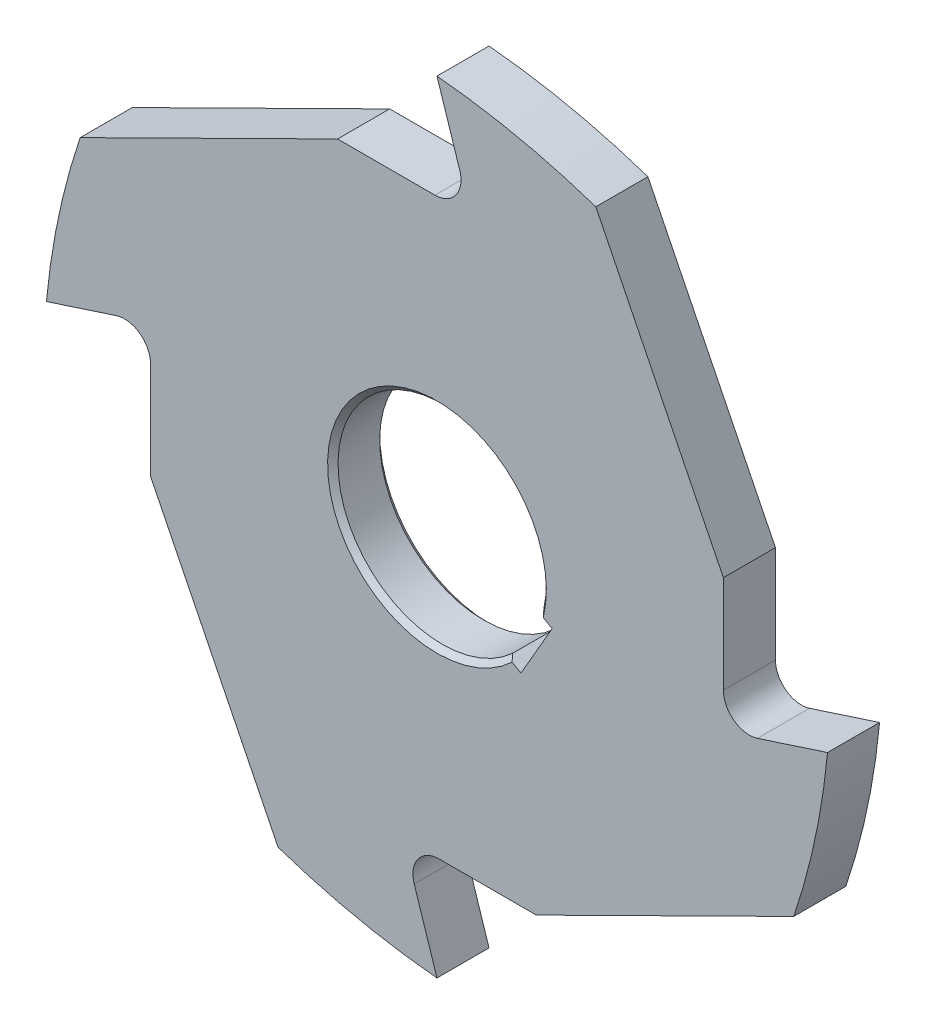
ISO-10303-21;
HEADER;
FILE_DESCRIPTION(('STEP AP214'),'2;1');
FILE_NAME('part.step','',(''),(''),'','','');
FILE_SCHEMA(('AUTOMOTIVE_DESIGN { 1 0 10303 214 1 1 1 1 }'));
ENDSEC;
DATA;
#1=APPLICATION_CONTEXT('core data for automotive mechanical design processes');
#2=APPLICATION_PROTOCOL_DEFINITION('international standard','automotive_design',2000,#1);
#3=PRODUCT_CONTEXT('',#1,'mechanical');
#4=PRODUCT('Part','Part','',(#3));
#5=PRODUCT_RELATED_PRODUCT_CATEGORY('part','',(#4));
#6=PRODUCT_DEFINITION_FORMATION('','',#4);
#7=PRODUCT_DEFINITION_CONTEXT('part definition',#1,'design');
#8=PRODUCT_DEFINITION('design','',#6,#7);
#9=PRODUCT_DEFINITION_SHAPE('','',#8);
#10=(LENGTH_UNIT() NAMED_UNIT(*) SI_UNIT(.MILLI.,.METRE.));
#11=(NAMED_UNIT(*) PLANE_ANGLE_UNIT() SI_UNIT($,.RADIAN.));
#12=(NAMED_UNIT(*) SI_UNIT($,.STERADIAN.) SOLID_ANGLE_UNIT());
#13=UNCERTAINTY_MEASURE_WITH_UNIT(LENGTH_MEASURE(1.E-05),#10,'distance_accuracy_value','');
#14=(GEOMETRIC_REPRESENTATION_CONTEXT(3) GLOBAL_UNCERTAINTY_ASSIGNED_CONTEXT((#13)) GLOBAL_UNIT_ASSIGNED_CONTEXT((#10,
#11,#12)) REPRESENTATION_CONTEXT('',''));
#15=CARTESIAN_POINT('',(0.,0.,0.));
#16=DIRECTION('',(0.,0.,1.));
#17=DIRECTION('',(1.,0.,0.));
#18=AXIS2_PLACEMENT_3D('',#15,#16,#17);
#19=CARTESIAN_POINT('',(0.,0.,-10.));
#20=DIRECTION('',(0.,0.,1.));
#21=DIRECTION('',(1.,0.,0.));
#22=AXIS2_PLACEMENT_3D('',#19,#20,#21);
#23=CYLINDRICAL_SURFACE('',#22,20.);
#24=DIRECTION('',(0.,0.,1.));
#25=VECTOR('',#24,1.);
#26=CARTESIAN_POINT('',(13.5227116418582,-14.7355444368762,-10.));
#27=LINE('',#26,#25);
#28=CARTESIAN_POINT('',(13.5227116418582,-14.7355444368762,-8.99999999999999));
#29=VERTEX_POINT('',#28);
#30=CARTESIAN_POINT('',(13.5227116418582,-14.7355444368762,-0.999999999999973));
#31=VERTEX_POINT('',#30);
#32=EDGE_CURVE('E351',#29,#31,#27,.T.);
#33=ORIENTED_EDGE('',*,*,#32,.F.);
#34=CARTESIAN_POINT('',(0.,0.,-8.99999999999999));
#35=DIRECTION('',(0.,0.,1.));
#36=DIRECTION('',(1.,0.,0.));
#37=AXIS2_PLACEMENT_3D('',#34,#35,#36);
#38=CIRCLE('',#37,20.);
#39=CARTESIAN_POINT('',(19.5227116418583,-4.34323959146292,-8.99999999999999));
#40=VERTEX_POINT('',#39);
#41=EDGE_CURVE('E529',#29,#40,#38,.F.);
#42=ORIENTED_EDGE('',*,*,#41,.T.);
#43=DIRECTION('',(0.,0.,1.));
#44=VECTOR('',#43,1.);
#45=CARTESIAN_POINT('',(19.5227116418583,-4.34323959146292,-10.));
#46=LINE('',#45,#44);
#47=CARTESIAN_POINT('',(19.5227116418583,-4.34323959146292,-0.999999999999973));
#48=VERTEX_POINT('',#47);
#49=EDGE_CURVE('E361',#40,#48,#46,.T.);
#50=ORIENTED_EDGE('',*,*,#49,.T.);
#51=CARTESIAN_POINT('',(0.,0.,-0.999999999999973));
#52=DIRECTION('',(0.,0.,1.));
#53=DIRECTION('',(1.,0.,0.));
#54=AXIS2_PLACEMENT_3D('',#51,#52,#53);
#55=CIRCLE('',#54,20.);
#56=EDGE_CURVE('E531',#48,#31,#55,.T.);
#57=ORIENTED_EDGE('',*,*,#56,.T.);
#58=EDGE_LOOP('',(#33,#42,#50,#57));
#59=FACE_BOUND('',#58,.T.);
#60=ADVANCED_FACE('F35',(#59),#23,.F.);
#61=CARTESIAN_POINT('',(-3.00000000000003,-5.19615242270663,-10.));
#62=DIRECTION('',(-0.500000000000003,-0.866025403784437,0.));
#63=DIRECTION('',(0.866025403784437,-0.500000000000003,0.));
#64=AXIS2_PLACEMENT_3D('',#61,#62,#63);
#65=PLANE('',#64);
#66=DIRECTION('',(0.866025403784437,-0.500000000000003,0.));
#67=VECTOR('',#66,1.);
#68=CARTESIAN_POINT('',(-3.00000000000003,-5.19615242270663,-10.));
#69=LINE('',#68,#67);
#70=CARTESIAN_POINT('',(14.4284250579333,-15.2584583214558,-10.));
#71=VERTEX_POINT('',#70);
#72=CARTESIAN_POINT('',(16.1207878532115,-16.2355444368762,-10.));
#73=VERTEX_POINT('',#72);
#74=EDGE_CURVE('E220',#71,#73,#69,.T.);
#75=ORIENTED_EDGE('',*,*,#74,.F.);
#76=CARTESIAN_POINT('',(14.4284250579333,-15.2584583214558,-10.));
#77=CARTESIAN_POINT('',(14.2776376878442,-15.1714011927444,-9.83313424107122));
#78=CARTESIAN_POINT('',(14.1267678853945,-15.0842964716875,-9.66636802893565));
#79=CARTESIAN_POINT('',(13.8248634133721,-14.9099918434958,-9.33303469559915));
#80=CARTESIAN_POINT('',(13.6738287437968,-14.8227919363595,-9.16646757440138));
#81=CARTESIAN_POINT('',(13.5227116418582,-14.7355444368762,-8.99999999999999));
#82=B_SPLINE_CURVE_WITH_KNOTS('',3,(#76,#77,#78,#79,#80,#81),.UNSPECIFIED.,.F.,.F.,(4,2,4),(0.,
0.723490907396184,1.44698182630376),.UNSPECIFIED.);
#83=EDGE_CURVE('E407',#71,#29,#82,.T.);
#84=ORIENTED_EDGE('',*,*,#83,.T.);
#85=ORIENTED_EDGE('',*,*,#32,.T.);
#86=CARTESIAN_POINT('',(13.5227116418582,-14.7355444368762,-0.999999999999973));
#87=CARTESIAN_POINT('',(13.6738287437968,-14.8227919363595,-0.833532425598594));
#88=CARTESIAN_POINT('',(13.8248634133721,-14.9099918434958,-0.666965304400827));
#89=CARTESIAN_POINT('',(14.1267678853945,-15.0842964716875,-0.333631971064335));
#90=CARTESIAN_POINT('',(14.2776376878442,-15.1714011927444,-0.166865758928778));
#91=CARTESIAN_POINT('',(14.4284250579333,-15.2584583214557,0.));
#92=B_SPLINE_CURVE_WITH_KNOTS('',3,(#86,#87,#88,#89,#90,#91),.UNSPECIFIED.,.F.,.F.,(4,2,4),(0.,
0.723490918907552,1.44698182630371),.UNSPECIFIED.);
#93=CARTESIAN_POINT('',(14.4284250579333,-15.2584583214557,0.));
#94=VERTEX_POINT('',#93);
#95=EDGE_CURVE('E401',#31,#94,#92,.T.);
#96=ORIENTED_EDGE('',*,*,#95,.T.);
#97=DIRECTION('',(0.866025403784437,-0.500000000000003,0.));
#98=VECTOR('',#97,1.);
#99=CARTESIAN_POINT('',(-3.00000000000003,-5.19615242270663,0.));
#100=LINE('',#99,#98);
#101=CARTESIAN_POINT('',(16.1207878532115,-16.2355444368762,0.));
#102=VERTEX_POINT('',#101);
#103=EDGE_CURVE('E229',#94,#102,#100,.T.);
#104=ORIENTED_EDGE('',*,*,#103,.T.);
#105=DIRECTION('',(0.,0.,1.));
#106=VECTOR('',#105,1.);
#107=CARTESIAN_POINT('',(16.1207878532115,-16.2355444368762,-10.));
#108=LINE('',#107,#106);
#109=EDGE_CURVE('E355',#73,#102,#108,.T.);
#110=ORIENTED_EDGE('',*,*,#109,.F.);
#111=EDGE_LOOP('',(#75,#84,#85,#96,#104,#110));
#112=FACE_BOUND('',#111,.T.);
#113=ADVANCED_FACE('F412',(#112),#65,.F.);
#114=CARTESIAN_POINT('',(19.1207878532116,-11.0393920141695,-10.));
#115=DIRECTION('',(-0.866025403784436,0.500000000000004,0.));
#116=DIRECTION('',(-0.500000000000004,-0.866025403784436,0.));
#117=AXIS2_PLACEMENT_3D('',#114,#115,#116);
#118=PLANE('',#117);
#119=DIRECTION('',(-0.500000000000004,-0.866025403784436,0.));
#120=VECTOR('',#119,1.);
#121=CARTESIAN_POINT('',(19.1207878532116,-11.0393920141695,0.));
#122=LINE('',#121,#120);
#123=CARTESIAN_POINT('',(22.1207878532116,-5.84323959146293,0.));
#124=VERTEX_POINT('',#123);
#125=EDGE_CURVE('E347',#124,#102,#122,.T.);
#126=ORIENTED_EDGE('',*,*,#125,.F.);
#127=DIRECTION('',(0.,0.,1.));
#128=VECTOR('',#127,1.);
#129=CARTESIAN_POINT('',(22.1207878532116,-5.84323959146293,-10.));
#130=LINE('',#129,#128);
#131=CARTESIAN_POINT('',(22.1207878532116,-5.84323959146293,-10.));
#132=VERTEX_POINT('',#131);
#133=EDGE_CURVE('E358',#132,#124,#130,.T.);
#134=ORIENTED_EDGE('',*,*,#133,.F.);
#135=DIRECTION('',(-0.500000000000004,-0.866025403784436,0.));
#136=VECTOR('',#135,1.);
#137=CARTESIAN_POINT('',(19.1207878532116,-11.0393920141695,-10.));
#138=LINE('',#137,#136);
#139=EDGE_CURVE('E284',#132,#73,#138,.T.);
#140=ORIENTED_EDGE('',*,*,#139,.T.);
#141=ORIENTED_EDGE('',*,*,#109,.T.);
#142=EDGE_LOOP('',(#126,#134,#140,#141));
#143=FACE_BOUND('',#142,.T.);
#144=ADVANCED_FACE('F417',(#143),#118,.T.);
#145=CARTESIAN_POINT('',(-60.,-0.3835156776972,-10.));
#146=DIRECTION('',(0.,0.,1.));
#147=DIRECTION('',(1.,0.,0.));
#148=AXIS2_PLACEMENT_3D('',#145,#146,#147);
#149=CYLINDRICAL_SURFACE('',#148,4.99999999999999);
#150=CARTESIAN_POINT('',(-60.,-0.3835156776972,0.));
#151=DIRECTION('',(0.,0.,1.));
#152=DIRECTION('',(1.,0.,0.));
#153=AXIS2_PLACEMENT_3D('',#150,#151,#152);
#154=CIRCLE('',#153,4.99999999999999);
#155=CARTESIAN_POINT('',(-55.,-0.383515677697252,0.));
#156=VERTEX_POINT('',#155);
#157=CARTESIAN_POINT('',(-61.5450849718746,4.3717669037786,0.));
#158=VERTEX_POINT('',#157);
#159=EDGE_CURVE('E288',#156,#158,#154,.T.);
#160=ORIENTED_EDGE('',*,*,#159,.T.);
#161=DIRECTION('',(0.,0.,1.));
#162=VECTOR('',#161,1.);
#163=CARTESIAN_POINT('',(-61.5450849718746,4.3717669037786,-10.));
#164=LINE('',#163,#162);
#165=CARTESIAN_POINT('',(-61.5450849718746,4.3717669037786,-10.));
#166=VERTEX_POINT('',#165);
#167=EDGE_CURVE('E225',#166,#158,#164,.T.);
#168=ORIENTED_EDGE('',*,*,#167,.F.);
#169=CARTESIAN_POINT('',(-60.,-0.3835156776972,-10.));
#170=DIRECTION('',(0.,0.,1.));
#171=DIRECTION('',(1.,0.,0.));
#172=AXIS2_PLACEMENT_3D('',#169,#170,#171);
#173=CIRCLE('',#172,4.99999999999999);
#174=CARTESIAN_POINT('',(-55.,-0.383515677697252,-10.));
#175=VERTEX_POINT('',#174);
#176=EDGE_CURVE('E223',#175,#166,#173,.T.);
#177=ORIENTED_EDGE('',*,*,#176,.F.);
#178=DIRECTION('',(0.,0.,1.));
#179=VECTOR('',#178,1.);
#180=CARTESIAN_POINT('',(-55.,-0.383515677697252,-10.));
#181=LINE('',#180,#179);
#182=EDGE_CURVE('E209',#175,#156,#181,.T.);
#183=ORIENTED_EDGE('',*,*,#182,.T.);
#184=EDGE_LOOP('',(#160,#168,#177,#183));
#185=FACE_BOUND('',#184,.T.);
#186=ADVANCED_FACE('F224',(#185),#149,.F.);
#187=CARTESIAN_POINT('',(-7.16186271093895,22.0419469609674,-10.));
#188=DIRECTION('',(0.309016994374931,-0.951056516295159,0.));
#189=DIRECTION('',(0.951056516295159,0.309016994374931,0.));
#190=AXIS2_PLACEMENT_3D('',#187,#188,#189);
#191=PLANE('',#190);
#192=DIRECTION('',(0.951056516295159,0.309016994374931,0.));
#193=VECTOR('',#192,1.);
#194=CARTESIAN_POINT('',(-7.16186271093895,22.0419469609674,0.));
#195=LINE('',#194,#193);
#196=CARTESIAN_POINT('',(-75.,7.8756445809347E-13,0.));
#197=VERTEX_POINT('',#196);
#198=EDGE_CURVE('E342',#197,#158,#195,.T.);
#199=ORIENTED_EDGE('',*,*,#198,.F.);
#200=DIRECTION('',(0.,0.,1.));
#201=VECTOR('',#200,1.);
#202=CARTESIAN_POINT('',(-75.,7.8756445809347E-13,-10.));
#203=LINE('',#202,#201);
#204=CARTESIAN_POINT('',(-75.,7.8756445809347E-13,-10.));
#205=VERTEX_POINT('',#204);
#206=EDGE_CURVE('E364',#205,#197,#203,.T.);
#207=ORIENTED_EDGE('',*,*,#206,.F.);
#208=DIRECTION('',(0.951056516295159,0.309016994374931,0.));
#209=VECTOR('',#208,1.);
#210=CARTESIAN_POINT('',(-7.16186271093895,22.0419469609674,-10.));
#211=LINE('',#210,#209);
#212=EDGE_CURVE('E280',#205,#166,#211,.T.);
#213=ORIENTED_EDGE('',*,*,#212,.T.);
#214=ORIENTED_EDGE('',*,*,#167,.T.);
#215=EDGE_LOOP('',(#199,#207,#213,#214));
#216=FACE_BOUND('',#215,.T.);
#217=ADVANCED_FACE('F447',(#216),#191,.T.);
#218=CARTESIAN_POINT('',(59.4081249488118,-12.6275867743834,-10.));
#219=DIRECTION('',(0.,0.,1.));
#220=DIRECTION('',(1.,0.,0.));
#221=AXIS2_PLACEMENT_3D('',#218,#219,#220);
#222=CYLINDRICAL_SURFACE('',#221,135.);
#223=CARTESIAN_POINT('',(59.4081249488118,-12.6275867743834,0.));
#224=DIRECTION('',(0.,0.,1.));
#225=DIRECTION('',(1.,0.,0.));
#226=AXIS2_PLACEMENT_3D('',#223,#224,#225);
#227=CIRCLE('',#226,135.);
#228=CARTESIAN_POINT('',(-68.5159093231945,30.5052482306864,0.));
#229=VERTEX_POINT('',#228);
#230=EDGE_CURVE('E339',#197,#229,#227,.F.);
#231=ORIENTED_EDGE('',*,*,#230,.T.);
#232=DIRECTION('',(0.,0.,1.));
#233=VECTOR('',#232,1.);
#234=CARTESIAN_POINT('',(-68.5159093231945,30.5052482306864,-10.));
#235=LINE('',#234,#233);
#236=CARTESIAN_POINT('',(-68.5159093231945,30.5052482306864,-10.));
#237=VERTEX_POINT('',#236);
#238=EDGE_CURVE('E366',#237,#229,#235,.T.);
#239=ORIENTED_EDGE('',*,*,#238,.F.);
#240=CARTESIAN_POINT('',(59.4081249488118,-12.6275867743834,-10.));
#241=DIRECTION('',(0.,0.,1.));
#242=DIRECTION('',(1.,0.,0.));
#243=AXIS2_PLACEMENT_3D('',#240,#241,#242);
#244=CIRCLE('',#243,135.);
#245=EDGE_CURVE('E278',#205,#237,#244,.F.);
#246=ORIENTED_EDGE('',*,*,#245,.F.);
#247=ORIENTED_EDGE('',*,*,#206,.T.);
#248=EDGE_LOOP('',(#231,#239,#246,#247));
#249=FACE_BOUND('',#248,.T.);
#250=ADVANCED_FACE('F513',(#249),#222,.T.);
#251=CARTESIAN_POINT('',(-25.6402170443291,51.7489882953533,-10.));
#252=DIRECTION('',(-0.443965408465407,0.896043925310665,0.));
#253=DIRECTION('',(-0.896043925310665,-0.443965408465407,0.));
#254=AXIS2_PLACEMENT_3D('',#251,#252,#253);
#255=PLANE('',#254);
#256=DIRECTION('',(-0.896043925310665,-0.443965408465407,0.));
#257=VECTOR('',#256,1.);
#258=CARTESIAN_POINT('',(-25.6402170443291,51.7489882953533,0.));
#259=LINE('',#258,#257);
#260=CARTESIAN_POINT('',(-19.0787840283387,55.,0.));
#261=VERTEX_POINT('',#260);
#262=EDGE_CURVE('E336',#261,#229,#259,.T.);
#263=ORIENTED_EDGE('',*,*,#262,.F.);
#264=DIRECTION('',(0.,0.,1.));
#265=VECTOR('',#264,1.);
#266=CARTESIAN_POINT('',(-19.0787840283387,55.,-10.));
#267=LINE('',#266,#265);
#268=CARTESIAN_POINT('',(-19.0787840283387,55.,-10.));
#269=VERTEX_POINT('',#268);
#270=EDGE_CURVE('E368',#269,#261,#267,.T.);
#271=ORIENTED_EDGE('',*,*,#270,.F.);
#272=DIRECTION('',(-0.896043925310665,-0.443965408465407,0.));
#273=VECTOR('',#272,1.);
#274=CARTESIAN_POINT('',(-25.6402170443291,51.7489882953533,-10.));
#275=LINE('',#274,#273);
#276=EDGE_CURVE('E275',#269,#237,#275,.T.);
#277=ORIENTED_EDGE('',*,*,#276,.T.);
#278=ORIENTED_EDGE('',*,*,#238,.T.);
#279=EDGE_LOOP('',(#263,#271,#277,#278));
#280=FACE_BOUND('',#279,.T.);
#281=ADVANCED_FACE('F509',(#280),#255,.T.);
#282=CARTESIAN_POINT('',(0.,55.,-10.));
#283=DIRECTION('',(0.,1.,0.));
#284=DIRECTION('',(-1.,0.,0.));
#285=AXIS2_PLACEMENT_3D('',#282,#283,#284);
#286=PLANE('',#285);
#287=DIRECTION('',(-1.,0.,0.));
#288=VECTOR('',#287,1.);
#289=CARTESIAN_POINT('',(0.,55.,0.));
#290=LINE('',#289,#288);
#291=CARTESIAN_POINT('',(-0.383515677697828,55.,0.));
#292=VERTEX_POINT('',#291);
#293=EDGE_CURVE('E333',#292,#261,#290,.T.);
#294=ORIENTED_EDGE('',*,*,#293,.F.);
#295=DIRECTION('',(0.,0.,1.));
#296=VECTOR('',#295,1.);
#297=CARTESIAN_POINT('',(-0.383515677697828,55.,-10.));
#298=LINE('',#297,#296);
#299=CARTESIAN_POINT('',(-0.383515677697828,55.,-10.));
#300=VERTEX_POINT('',#299);
#301=EDGE_CURVE('E370',#300,#292,#298,.T.);
#302=ORIENTED_EDGE('',*,*,#301,.F.);
#303=DIRECTION('',(-1.,0.,0.));
#304=VECTOR('',#303,1.);
#305=CARTESIAN_POINT('',(0.,55.,-10.));
#306=LINE('',#305,#304);
#307=EDGE_CURVE('E272',#300,#269,#306,.T.);
#308=ORIENTED_EDGE('',*,*,#307,.T.);
#309=ORIENTED_EDGE('',*,*,#270,.T.);
#310=EDGE_LOOP('',(#294,#302,#308,#309));
#311=FACE_BOUND('',#310,.T.);
#312=ADVANCED_FACE('F505',(#311),#286,.T.);
#313=CARTESIAN_POINT('',(-0.383515677697828,60.,-10.));
#314=DIRECTION('',(0.,0.,1.));
#315=DIRECTION('',(1.,0.,0.));
#316=AXIS2_PLACEMENT_3D('',#313,#314,#315);
#317=CYLINDRICAL_SURFACE('',#316,4.99999999999999);
#318=CARTESIAN_POINT('',(-0.383515677697828,60.,0.));
#319=DIRECTION('',(0.,0.,1.));
#320=DIRECTION('',(1.,0.,0.));
#321=AXIS2_PLACEMENT_3D('',#318,#319,#320);
#322=CIRCLE('',#321,4.99999999999999);
#323=CARTESIAN_POINT('',(4.37176690377795,61.5450849718747,0.));
#324=VERTEX_POINT('',#323);
#325=EDGE_CURVE('E330',#292,#324,#322,.T.);
#326=ORIENTED_EDGE('',*,*,#325,.T.);
#327=DIRECTION('',(0.,0.,1.));
#328=VECTOR('',#327,1.);
#329=CARTESIAN_POINT('',(4.37176690377795,61.5450849718747,-10.));
#330=LINE('',#329,#328);
#331=CARTESIAN_POINT('',(4.37176690377795,61.5450849718747,-10.));
#332=VERTEX_POINT('',#331);
#333=EDGE_CURVE('E372',#332,#324,#330,.T.);
#334=ORIENTED_EDGE('',*,*,#333,.F.);
#335=CARTESIAN_POINT('',(-0.383515677697828,60.,-10.));
#336=DIRECTION('',(0.,0.,1.));
#337=DIRECTION('',(1.,0.,0.));
#338=AXIS2_PLACEMENT_3D('',#335,#336,#337);
#339=CIRCLE('',#338,4.99999999999999);
#340=EDGE_CURVE('E270',#300,#332,#339,.T.);
#341=ORIENTED_EDGE('',*,*,#340,.F.);
#342=ORIENTED_EDGE('',*,*,#301,.T.);
#343=EDGE_LOOP('',(#326,#334,#341,#342));
#344=FACE_BOUND('',#343,.T.);
#345=ADVANCED_FACE('F501',(#344),#317,.F.);
#346=CARTESIAN_POINT('',(22.0419469609674,7.16186271093919,-10.));
#347=DIRECTION('',(-0.951056516295156,-0.309016994374941,0.));
#348=DIRECTION('',(0.309016994374941,-0.951056516295156,0.));
#349=AXIS2_PLACEMENT_3D('',#346,#347,#348);
#350=PLANE('',#349);
#351=DIRECTION('',(0.309016994374941,-0.951056516295156,0.));
#352=VECTOR('',#351,1.);
#353=CARTESIAN_POINT('',(22.0419469609674,7.16186271093919,0.));
#354=LINE('',#353,#352);
#355=CARTESIAN_POINT('',(0.,75.,0.));
#356=VERTEX_POINT('',#355);
#357=EDGE_CURVE('E327',#356,#324,#354,.T.);
#358=ORIENTED_EDGE('',*,*,#357,.F.);
#359=DIRECTION('',(0.,0.,1.));
#360=VECTOR('',#359,1.);
#361=CARTESIAN_POINT('',(0.,75.,-10.));
#362=LINE('',#361,#360);
#363=CARTESIAN_POINT('',(0.,75.,-10.));
#364=VERTEX_POINT('',#363);
#365=EDGE_CURVE('E374',#364,#356,#362,.T.);
#366=ORIENTED_EDGE('',*,*,#365,.F.);
#367=DIRECTION('',(0.309016994374941,-0.951056516295156,0.));
#368=VECTOR('',#367,1.);
#369=CARTESIAN_POINT('',(22.0419469609674,7.16186271093919,-10.));
#370=LINE('',#369,#368);
#371=EDGE_CURVE('E267',#364,#332,#370,.T.);
#372=ORIENTED_EDGE('',*,*,#371,.T.);
#373=ORIENTED_EDGE('',*,*,#333,.T.);
#374=EDGE_LOOP('',(#358,#366,#372,#373));
#375=FACE_BOUND('',#374,.T.);
#376=ADVANCED_FACE('F497',(#375),#350,.T.);
#377=CARTESIAN_POINT('',(-12.6275867743828,-59.4081249488119,-10.));
#378=DIRECTION('',(0.,0.,1.));
#379=DIRECTION('',(1.,0.,0.));
#380=AXIS2_PLACEMENT_3D('',#377,#378,#379);
#381=CYLINDRICAL_SURFACE('',#380,135.);
#382=CARTESIAN_POINT('',(-12.6275867743828,-59.4081249488119,0.));
#383=DIRECTION('',(0.,0.,1.));
#384=DIRECTION('',(1.,0.,0.));
#385=AXIS2_PLACEMENT_3D('',#382,#383,#384);
#386=CIRCLE('',#385,135.);
#387=CARTESIAN_POINT('',(30.5052482306857,68.5159093231948,0.));
#388=VERTEX_POINT('',#387);
#389=EDGE_CURVE('E324',#356,#388,#386,.F.);
#390=ORIENTED_EDGE('',*,*,#389,.T.);
#391=DIRECTION('',(0.,0.,1.));
#392=VECTOR('',#391,1.);
#393=CARTESIAN_POINT('',(30.5052482306857,68.5159093231948,-10.));
#394=LINE('',#393,#392);
#395=CARTESIAN_POINT('',(30.5052482306857,68.5159093231948,-10.));
#396=VERTEX_POINT('',#395);
#397=EDGE_CURVE('E376',#396,#388,#394,.T.);
#398=ORIENTED_EDGE('',*,*,#397,.F.);
#399=CARTESIAN_POINT('',(-12.6275867743828,-59.4081249488119,-10.));
#400=DIRECTION('',(0.,0.,1.));
#401=DIRECTION('',(1.,0.,0.));
#402=AXIS2_PLACEMENT_3D('',#399,#400,#401);
#403=CIRCLE('',#402,135.);
#404=EDGE_CURVE('E265',#364,#396,#403,.F.);
#405=ORIENTED_EDGE('',*,*,#404,.F.);
#406=ORIENTED_EDGE('',*,*,#365,.T.);
#407=EDGE_LOOP('',(#390,#398,#405,#406));
#408=FACE_BOUND('',#407,.T.);
#409=ADVANCED_FACE('F493',(#408),#381,.T.);
#410=CARTESIAN_POINT('',(51.748988295353,25.6402170443297,-10.));
#411=DIRECTION('',(0.89604392531066,0.443965408465416,0.));
#412=DIRECTION('',(-0.443965408465416,0.89604392531066,0.));
#413=AXIS2_PLACEMENT_3D('',#410,#411,#412);
#414=PLANE('',#413);
#415=DIRECTION('',(-0.443965408465416,0.89604392531066,0.));
#416=VECTOR('',#415,1.);
#417=CARTESIAN_POINT('',(51.748988295353,25.6402170443297,0.));
#418=LINE('',#417,#416);
#419=CARTESIAN_POINT('',(55.,19.0787840283389,0.));
#420=VERTEX_POINT('',#419);
#421=EDGE_CURVE('E321',#420,#388,#418,.T.);
#422=ORIENTED_EDGE('',*,*,#421,.F.);
#423=DIRECTION('',(0.,0.,1.));
#424=VECTOR('',#423,1.);
#425=CARTESIAN_POINT('',(55.,19.0787840283389,-10.));
#426=LINE('',#425,#424);
#427=CARTESIAN_POINT('',(55.,19.0787840283389,-10.));
#428=VERTEX_POINT('',#427);
#429=EDGE_CURVE('E378',#428,#420,#426,.T.);
#430=ORIENTED_EDGE('',*,*,#429,.F.);
#431=DIRECTION('',(-0.443965408465416,0.89604392531066,0.));
#432=VECTOR('',#431,1.);
#433=CARTESIAN_POINT('',(51.748988295353,25.6402170443297,-10.));
#434=LINE('',#433,#432);
#435=EDGE_CURVE('E262',#428,#396,#434,.T.);
#436=ORIENTED_EDGE('',*,*,#435,.T.);
#437=ORIENTED_EDGE('',*,*,#397,.T.);
#438=EDGE_LOOP('',(#422,#430,#436,#437));
#439=FACE_BOUND('',#438,.T.);
#440=ADVANCED_FACE('F489',(#439),#414,.T.);
#441=CARTESIAN_POINT('',(55.,0.,-10.));
#442=DIRECTION('',(1.,0.,0.));
#443=DIRECTION('',(0.,1.,0.));
#444=AXIS2_PLACEMENT_3D('',#441,#442,#443);
#445=PLANE('',#444);
#446=DIRECTION('',(0.,1.,0.));
#447=VECTOR('',#446,1.);
#448=CARTESIAN_POINT('',(55.,0.,0.));
#449=LINE('',#448,#447);
#450=CARTESIAN_POINT('',(55.,0.383515677697636,0.));
#451=VERTEX_POINT('',#450);
#452=EDGE_CURVE('E318',#451,#420,#449,.T.);
#453=ORIENTED_EDGE('',*,*,#452,.F.);
#454=DIRECTION('',(0.,0.,1.));
#455=VECTOR('',#454,1.);
#456=CARTESIAN_POINT('',(55.,0.383515677697636,-10.));
#457=LINE('',#456,#455);
#458=CARTESIAN_POINT('',(55.,0.383515677697636,-10.));
#459=VERTEX_POINT('',#458);
#460=EDGE_CURVE('E380',#459,#451,#457,.T.);
#461=ORIENTED_EDGE('',*,*,#460,.F.);
#462=DIRECTION('',(0.,1.,0.));
#463=VECTOR('',#462,1.);
#464=CARTESIAN_POINT('',(55.,0.,-10.));
#465=LINE('',#464,#463);
#466=EDGE_CURVE('E259',#459,#428,#465,.T.);
#467=ORIENTED_EDGE('',*,*,#466,.T.);
#468=ORIENTED_EDGE('',*,*,#429,.T.);
#469=EDGE_LOOP('',(#453,#461,#467,#468));
#470=FACE_BOUND('',#469,.T.);
#471=ADVANCED_FACE('F485',(#470),#445,.T.);
#472=CARTESIAN_POINT('',(60.,0.383515677697619,-10.));
#473=DIRECTION('',(0.,0.,1.));
#474=DIRECTION('',(1.,0.,0.));
#475=AXIS2_PLACEMENT_3D('',#472,#473,#474);
#476=CYLINDRICAL_SURFACE('',#475,5.);
#477=CARTESIAN_POINT('',(60.,0.383515677697619,0.));
#478=DIRECTION('',(0.,0.,1.));
#479=DIRECTION('',(1.,0.,0.));
#480=AXIS2_PLACEMENT_3D('',#477,#478,#479);
#481=CIRCLE('',#480,5.);
#482=CARTESIAN_POINT('',(61.5450849718747,-4.37176690377817,0.));
#483=VERTEX_POINT('',#482);
#484=EDGE_CURVE('E315',#451,#483,#481,.T.);
#485=ORIENTED_EDGE('',*,*,#484,.T.);
#486=DIRECTION('',(0.,0.,1.));
#487=VECTOR('',#486,1.);
#488=CARTESIAN_POINT('',(61.5450849718747,-4.37176690377817,-10.));
#489=LINE('',#488,#487);
#490=CARTESIAN_POINT('',(61.5450849718747,-4.37176690377817,-10.));
#491=VERTEX_POINT('',#490);
#492=EDGE_CURVE('E382',#491,#483,#489,.T.);
#493=ORIENTED_EDGE('',*,*,#492,.F.);
#494=CARTESIAN_POINT('',(60.,0.383515677697619,-10.));
#495=DIRECTION('',(0.,0.,1.));
#496=DIRECTION('',(1.,0.,0.));
#497=AXIS2_PLACEMENT_3D('',#494,#495,#496);
#498=CIRCLE('',#497,5.);
#499=EDGE_CURVE('E257',#459,#491,#498,.T.);
#500=ORIENTED_EDGE('',*,*,#499,.F.);
#501=ORIENTED_EDGE('',*,*,#460,.T.);
#502=EDGE_LOOP('',(#485,#493,#500,#501));
#503=FACE_BOUND('',#502,.T.);
#504=ADVANCED_FACE('F481',(#503),#476,.F.);
#505=CARTESIAN_POINT('',(7.16186271093912,-22.0419469609674,-10.));
#506=DIRECTION('',(-0.309016994374938,0.951056516295157,0.));
#507=DIRECTION('',(-0.951056516295157,-0.309016994374938,0.));
#508=AXIS2_PLACEMENT_3D('',#505,#506,#507);
#509=PLANE('',#508);
#510=DIRECTION('',(-0.951056516295157,-0.309016994374938,0.));
#511=VECTOR('',#510,1.);
#512=CARTESIAN_POINT('',(7.16186271093912,-22.0419469609674,0.));
#513=LINE('',#512,#511);
#514=CARTESIAN_POINT('',(75.,-2.63677968348475E-13,0.));
#515=VERTEX_POINT('',#514);
#516=EDGE_CURVE('E312',#515,#483,#513,.T.);
#517=ORIENTED_EDGE('',*,*,#516,.F.);
#518=DIRECTION('',(0.,0.,1.));
#519=VECTOR('',#518,1.);
#520=CARTESIAN_POINT('',(75.,-2.63677968348475E-13,-10.));
#521=LINE('',#520,#519);
#522=CARTESIAN_POINT('',(75.,-2.63677968348475E-13,-10.));
#523=VERTEX_POINT('',#522);
#524=EDGE_CURVE('E384',#523,#515,#521,.T.);
#525=ORIENTED_EDGE('',*,*,#524,.F.);
#526=DIRECTION('',(-0.951056516295157,-0.309016994374938,0.));
#527=VECTOR('',#526,1.);
#528=CARTESIAN_POINT('',(7.16186271093912,-22.0419469609674,-10.));
#529=LINE('',#528,#527);
#530=EDGE_CURVE('E254',#523,#491,#529,.T.);
#531=ORIENTED_EDGE('',*,*,#530,.T.);
#532=ORIENTED_EDGE('',*,*,#492,.T.);
#533=EDGE_LOOP('',(#517,#525,#531,#532));
#534=FACE_BOUND('',#533,.T.);
#535=ADVANCED_FACE('F477',(#534),#509,.T.);
#536=CARTESIAN_POINT('',(-59.4081249488119,12.627586774383,-10.));
#537=DIRECTION('',(0.,0.,1.));
#538=DIRECTION('',(1.,0.,0.));
#539=AXIS2_PLACEMENT_3D('',#536,#537,#538);
#540=CYLINDRICAL_SURFACE('',#539,135.);
#541=CARTESIAN_POINT('',(-59.4081249488119,12.627586774383,0.));
#542=DIRECTION('',(0.,0.,1.));
#543=DIRECTION('',(1.,0.,0.));
#544=AXIS2_PLACEMENT_3D('',#541,#542,#543);
#545=CIRCLE('',#544,135.);
#546=CARTESIAN_POINT('',(68.5159093231947,-30.5052482306859,0.));
#547=VERTEX_POINT('',#546);
#548=EDGE_CURVE('E309',#515,#547,#545,.F.);
#549=ORIENTED_EDGE('',*,*,#548,.T.);
#550=DIRECTION('',(0.,0.,1.));
#551=VECTOR('',#550,1.);
#552=CARTESIAN_POINT('',(68.5159093231947,-30.5052482306859,-10.));
#553=LINE('',#552,#551);
#554=CARTESIAN_POINT('',(68.5159093231947,-30.5052482306859,-10.));
#555=VERTEX_POINT('',#554);
#556=EDGE_CURVE('E386',#555,#547,#553,.T.);
#557=ORIENTED_EDGE('',*,*,#556,.F.);
#558=CARTESIAN_POINT('',(-59.4081249488119,12.627586774383,-10.));
#559=DIRECTION('',(0.,0.,1.));
#560=DIRECTION('',(1.,0.,0.));
#561=AXIS2_PLACEMENT_3D('',#558,#559,#560);
#562=CIRCLE('',#561,135.);
#563=EDGE_CURVE('E252',#523,#555,#562,.F.);
#564=ORIENTED_EDGE('',*,*,#563,.F.);
#565=ORIENTED_EDGE('',*,*,#524,.T.);
#566=EDGE_LOOP('',(#549,#557,#564,#565));
#567=FACE_BOUND('',#566,.T.);
#568=ADVANCED_FACE('F473',(#567),#540,.T.);
#569=CARTESIAN_POINT('',(25.6402170443295,-51.7489882953531,-10.));
#570=DIRECTION('',(0.443965408465413,-0.896043925310662,0.));
#571=DIRECTION('',(0.896043925310662,0.443965408465413,0.));
#572=AXIS2_PLACEMENT_3D('',#569,#570,#571);
#573=PLANE('',#572);
#574=DIRECTION('',(0.896043925310662,0.443965408465413,0.));
#575=VECTOR('',#574,1.);
#576=CARTESIAN_POINT('',(25.6402170443295,-51.7489882953531,0.));
#577=LINE('',#576,#575);
#578=CARTESIAN_POINT('',(19.0787840283387,-55.0000000000001,0.));
#579=VERTEX_POINT('',#578);
#580=EDGE_CURVE('E306',#579,#547,#577,.T.);
#581=ORIENTED_EDGE('',*,*,#580,.F.);
#582=DIRECTION('',(0.,0.,1.));
#583=VECTOR('',#582,1.);
#584=CARTESIAN_POINT('',(19.0787840283387,-55.0000000000001,-10.));
#585=LINE('',#584,#583);
#586=CARTESIAN_POINT('',(19.0787840283387,-55.0000000000001,-10.));
#587=VERTEX_POINT('',#586);
#588=EDGE_CURVE('E388',#587,#579,#585,.T.);
#589=ORIENTED_EDGE('',*,*,#588,.F.);
#590=DIRECTION('',(0.896043925310662,0.443965408465413,0.));
#591=VECTOR('',#590,1.);
#592=CARTESIAN_POINT('',(25.6402170443295,-51.7489882953531,-10.));
#593=LINE('',#592,#591);
#594=EDGE_CURVE('E249',#587,#555,#593,.T.);
#595=ORIENTED_EDGE('',*,*,#594,.T.);
#596=ORIENTED_EDGE('',*,*,#556,.T.);
#597=EDGE_LOOP('',(#581,#589,#595,#596));
#598=FACE_BOUND('',#597,.T.);
#599=ADVANCED_FACE('F469',(#598),#573,.T.);
#600=CARTESIAN_POINT('',(-1.80029947261431E-13,-55.,-10.));
#601=DIRECTION('',(0.,-1.,0.));
#602=DIRECTION('',(1.,0.,0.));
#603=AXIS2_PLACEMENT_3D('',#600,#601,#602);
#604=PLANE('',#603);
#605=DIRECTION('',(1.,0.,0.));
#606=VECTOR('',#605,1.);
#607=CARTESIAN_POINT('',(-1.80029947261431E-13,-55.,0.));
#608=LINE('',#607,#606);
#609=CARTESIAN_POINT('',(0.383515677697444,-55.,0.));
#610=VERTEX_POINT('',#609);
#611=EDGE_CURVE('E303',#610,#579,#608,.T.);
#612=ORIENTED_EDGE('',*,*,#611,.F.);
#613=DIRECTION('',(0.,0.,1.));
#614=VECTOR('',#613,1.);
#615=CARTESIAN_POINT('',(0.383515677697444,-55.,-10.));
#616=LINE('',#615,#614);
#617=CARTESIAN_POINT('',(0.383515677697444,-55.,-10.));
#618=VERTEX_POINT('',#617);
#619=EDGE_CURVE('E390',#618,#610,#616,.T.);
#620=ORIENTED_EDGE('',*,*,#619,.F.);
#621=DIRECTION('',(1.,0.,0.));
#622=VECTOR('',#621,1.);
#623=CARTESIAN_POINT('',(-1.80029947261431E-13,-55.,-10.));
#624=LINE('',#623,#622);
#625=EDGE_CURVE('E246',#618,#587,#624,.T.);
#626=ORIENTED_EDGE('',*,*,#625,.T.);
#627=ORIENTED_EDGE('',*,*,#588,.T.);
#628=EDGE_LOOP('',(#612,#620,#626,#627));
#629=FACE_BOUND('',#628,.T.);
#630=ADVANCED_FACE('F465',(#629),#604,.T.);
#631=CARTESIAN_POINT('',(0.38351567769741,-60.,-10.));
#632=DIRECTION('',(0.,0.,1.));
#633=DIRECTION('',(1.,0.,0.));
#634=AXIS2_PLACEMENT_3D('',#631,#632,#633);
#635=CYLINDRICAL_SURFACE('',#634,5.);
#636=CARTESIAN_POINT('',(0.38351567769741,-60.,0.));
#637=DIRECTION('',(0.,0.,1.));
#638=DIRECTION('',(1.,0.,0.));
#639=AXIS2_PLACEMENT_3D('',#636,#637,#638);
#640=CIRCLE('',#639,5.);
#641=CARTESIAN_POINT('',(-4.37176690377838,-61.5450849718747,0.));
#642=VERTEX_POINT('',#641);
#643=EDGE_CURVE('E300',#610,#642,#640,.T.);
#644=ORIENTED_EDGE('',*,*,#643,.T.);
#645=DIRECTION('',(0.,0.,1.));
#646=VECTOR('',#645,1.);
#647=CARTESIAN_POINT('',(-4.37176690377838,-61.5450849718747,-10.));
#648=LINE('',#647,#646);
#649=CARTESIAN_POINT('',(-4.37176690377838,-61.5450849718747,-10.));
#650=VERTEX_POINT('',#649);
#651=EDGE_CURVE('E392',#650,#642,#648,.T.);
#652=ORIENTED_EDGE('',*,*,#651,.F.);
#653=CARTESIAN_POINT('',(0.38351567769741,-60.,-10.));
#654=DIRECTION('',(0.,0.,1.));
#655=DIRECTION('',(1.,0.,0.));
#656=AXIS2_PLACEMENT_3D('',#653,#654,#655);
#657=CIRCLE('',#656,5.);
#658=EDGE_CURVE('E244',#618,#650,#657,.T.);
#659=ORIENTED_EDGE('',*,*,#658,.F.);
#660=ORIENTED_EDGE('',*,*,#619,.T.);
#661=EDGE_LOOP('',(#644,#652,#659,#660));
#662=FACE_BOUND('',#661,.T.);
#663=ADVANCED_FACE('F461',(#662),#635,.F.);
#664=CARTESIAN_POINT('',(-22.0419469609674,-7.16186271093904,-10.));
#665=DIRECTION('',(0.951056516295158,0.309016994374935,0.));
#666=DIRECTION('',(-0.309016994374935,0.951056516295158,0.));
#667=AXIS2_PLACEMENT_3D('',#664,#665,#666);
#668=PLANE('',#667);
#669=DIRECTION('',(-0.309016994374935,0.951056516295158,0.));
#670=VECTOR('',#669,1.);
#671=CARTESIAN_POINT('',(-22.0419469609674,-7.16186271093904,0.));
#672=LINE('',#671,#670);
#673=CARTESIAN_POINT('',(-5.20417042793042E-13,-75.,0.));
#674=VERTEX_POINT('',#673);
#675=EDGE_CURVE('E297',#674,#642,#672,.T.);
#676=ORIENTED_EDGE('',*,*,#675,.F.);
#677=DIRECTION('',(0.,0.,1.));
#678=VECTOR('',#677,1.);
#679=CARTESIAN_POINT('',(-5.20417042793042E-13,-75.,-10.));
#680=LINE('',#679,#678);
#681=CARTESIAN_POINT('',(-5.20417042793042E-13,-75.,-10.));
#682=VERTEX_POINT('',#681);
#683=EDGE_CURVE('E394',#682,#674,#680,.T.);
#684=ORIENTED_EDGE('',*,*,#683,.F.);
#685=DIRECTION('',(-0.309016994374935,0.951056516295158,0.));
#686=VECTOR('',#685,1.);
#687=CARTESIAN_POINT('',(-22.0419469609674,-7.16186271093904,-10.));
#688=LINE('',#687,#686);
#689=EDGE_CURVE('E241',#682,#650,#688,.T.);
#690=ORIENTED_EDGE('',*,*,#689,.T.);
#691=ORIENTED_EDGE('',*,*,#651,.T.);
#692=EDGE_LOOP('',(#676,#684,#690,#691));
#693=FACE_BOUND('',#692,.T.);
#694=ADVANCED_FACE('F457',(#693),#668,.T.);
#695=CARTESIAN_POINT('',(12.6275867743832,59.4081249488118,-10.));
#696=DIRECTION('',(0.,0.,1.));
#697=DIRECTION('',(1.,0.,0.));
#698=AXIS2_PLACEMENT_3D('',#695,#696,#697);
#699=CYLINDRICAL_SURFACE('',#698,135.);
#700=CARTESIAN_POINT('',(12.6275867743832,59.4081249488118,0.));
#701=DIRECTION('',(0.,0.,1.));
#702=DIRECTION('',(1.,0.,0.));
#703=AXIS2_PLACEMENT_3D('',#700,#701,#702);
#704=CIRCLE('',#703,135.);
#705=CARTESIAN_POINT('',(-30.5052482306862,-68.5159093231946,0.));
#706=VERTEX_POINT('',#705);
#707=EDGE_CURVE('E294',#674,#706,#704,.F.);
#708=ORIENTED_EDGE('',*,*,#707,.T.);
#709=DIRECTION('',(0.,0.,1.));
#710=VECTOR('',#709,1.);
#711=CARTESIAN_POINT('',(-30.5052482306862,-68.5159093231946,-10.));
#712=LINE('',#711,#710);
#713=CARTESIAN_POINT('',(-30.5052482306862,-68.5159093231946,-10.));
#714=VERTEX_POINT('',#713);
#715=EDGE_CURVE('E396',#714,#706,#712,.T.);
#716=ORIENTED_EDGE('',*,*,#715,.F.);
#717=CARTESIAN_POINT('',(12.6275867743832,59.4081249488118,-10.));
#718=DIRECTION('',(0.,0.,1.));
#719=DIRECTION('',(1.,0.,0.));
#720=AXIS2_PLACEMENT_3D('',#717,#718,#719);
#721=CIRCLE('',#720,135.);
#722=EDGE_CURVE('E237',#682,#714,#721,.F.);
#723=ORIENTED_EDGE('',*,*,#722,.F.);
#724=ORIENTED_EDGE('',*,*,#683,.T.);
#725=EDGE_LOOP('',(#708,#716,#723,#724));
#726=FACE_BOUND('',#725,.T.);
#727=ADVANCED_FACE('F453',(#726),#699,.T.);
#728=CARTESIAN_POINT('',(-51.7489882953532,-25.6402170443293,-10.));
#729=DIRECTION('',(-0.896043925310663,-0.44396540846541,0.));
#730=DIRECTION('',(0.44396540846541,-0.896043925310663,0.));
#731=AXIS2_PLACEMENT_3D('',#728,#729,#730);
#732=PLANE('',#731);
#733=DIRECTION('',(0.44396540846541,-0.896043925310663,0.));
#734=VECTOR('',#733,1.);
#735=CARTESIAN_POINT('',(-51.7489882953532,-25.6402170443293,0.));
#736=LINE('',#735,#734);
#737=CARTESIAN_POINT('',(-55.0000000000001,-19.0787840283385,0.));
#738=VERTEX_POINT('',#737);
#739=EDGE_CURVE('E291',#738,#706,#736,.T.);
#740=ORIENTED_EDGE('',*,*,#739,.F.);
#741=DIRECTION('',(0.,0.,1.));
#742=VECTOR('',#741,1.);
#743=CARTESIAN_POINT('',(-55.0000000000001,-19.0787840283385,-10.));
#744=LINE('',#743,#742);
#745=CARTESIAN_POINT('',(-55.0000000000001,-19.0787840283385,-10.));
#746=VERTEX_POINT('',#745);
#747=EDGE_CURVE('E219',#746,#738,#744,.T.);
#748=ORIENTED_EDGE('',*,*,#747,.F.);
#749=DIRECTION('',(0.44396540846541,-0.896043925310663,0.));
#750=VECTOR('',#749,1.);
#751=CARTESIAN_POINT('',(-51.7489882953532,-25.6402170443293,-10.));
#752=LINE('',#751,#750);
#753=EDGE_CURVE('E235',#746,#714,#752,.T.);
#754=ORIENTED_EDGE('',*,*,#753,.T.);
#755=ORIENTED_EDGE('',*,*,#715,.T.);
#756=EDGE_LOOP('',(#740,#748,#754,#755));
#757=FACE_BOUND('',#756,.T.);
#758=ADVANCED_FACE('F450',(#757),#732,.T.);
#759=CARTESIAN_POINT('',(-55.,3.60059894522868E-13,-10.));
#760=DIRECTION('',(-1.,0.,0.));
#761=DIRECTION('',(0.,-1.,0.));
#762=AXIS2_PLACEMENT_3D('',#759,#760,#761);
#763=PLANE('',#762);
#764=DIRECTION('',(0.,-1.,0.));
#765=VECTOR('',#764,1.);
#766=CARTESIAN_POINT('',(-55.,3.60059894522868E-13,0.));
#767=LINE('',#766,#765);
#768=EDGE_CURVE('E215',#156,#738,#767,.T.);
#769=ORIENTED_EDGE('',*,*,#768,.F.);
#770=ORIENTED_EDGE('',*,*,#182,.F.);
#771=DIRECTION('',(0.,-1.,0.));
#772=VECTOR('',#771,1.);
#773=CARTESIAN_POINT('',(-55.,3.60059894522868E-13,-10.));
#774=LINE('',#773,#772);
#775=EDGE_CURVE('E213',#175,#746,#774,.T.);
#776=ORIENTED_EDGE('',*,*,#775,.T.);
#777=ORIENTED_EDGE('',*,*,#747,.T.);
#778=EDGE_LOOP('',(#769,#770,#776,#777));
#779=FACE_BOUND('',#778,.T.);
#780=ADVANCED_FACE('F211',(#779),#763,.T.);
#781=CARTESIAN_POINT('',(3.00000000000002,5.19615242270661,-10.));
#782=DIRECTION('',(-0.500000000000004,-0.866025403784437,0.));
#783=DIRECTION('',(0.866025403784437,-0.500000000000004,0.));
#784=AXIS2_PLACEMENT_3D('',#781,#782,#783);
#785=PLANE('',#784);
#786=ORIENTED_EDGE('',*,*,#49,.F.);
#787=CARTESIAN_POINT('',(19.5227116418583,-4.34323959146292,-8.99999999999999));
#788=CARTESIAN_POINT('',(19.6738287437968,-4.43048709094629,-9.16646757440138));
#789=CARTESIAN_POINT('',(19.8248634133721,-4.51768699808257,-9.33303469559915));
#790=CARTESIAN_POINT('',(20.1267678853945,-4.69199162627426,-9.66636802893565));
#791=CARTESIAN_POINT('',(20.2776376878443,-4.77909634733118,-9.83313424107122));
#792=CARTESIAN_POINT('',(20.4284250579334,-4.86615347604252,-10.));
#793=B_SPLINE_CURVE_WITH_KNOTS('',3,(#787,#788,#789,#790,#791,#792),.UNSPECIFIED.,.F.,.F.,(4,2,
4),(0.,0.723490918907575,1.44698182630376),.UNSPECIFIED.);
#794=CARTESIAN_POINT('',(20.4284250579334,-4.86615347604252,-10.));
#795=VERTEX_POINT('',#794);
#796=EDGE_CURVE('E44',#40,#795,#793,.T.);
#797=ORIENTED_EDGE('',*,*,#796,.T.);
#798=DIRECTION('',(0.866025403784437,-0.500000000000004,0.));
#799=VECTOR('',#798,1.);
#800=CARTESIAN_POINT('',(3.00000000000002,5.19615242270661,-10.));
#801=LINE('',#800,#799);
#802=EDGE_CURVE('E282',#795,#132,#801,.T.);
#803=ORIENTED_EDGE('',*,*,#802,.T.);
#804=ORIENTED_EDGE('',*,*,#133,.T.);
#805=DIRECTION('',(0.866025403784437,-0.500000000000004,0.));
#806=VECTOR('',#805,1.);
#807=CARTESIAN_POINT('',(3.00000000000002,5.19615242270661,0.));
#808=LINE('',#807,#806);
#809=CARTESIAN_POINT('',(20.4284250579333,-4.86615347604251,0.));
#810=VERTEX_POINT('',#809);
#811=EDGE_CURVE('E345',#810,#124,#808,.T.);
#812=ORIENTED_EDGE('',*,*,#811,.F.);
#813=CARTESIAN_POINT('',(20.4284250579333,-4.8661534760425,0.));
#814=CARTESIAN_POINT('',(20.2776376878442,-4.77909634733117,-0.166865758928777));
#815=CARTESIAN_POINT('',(20.1267678853945,-4.69199162627425,-0.333631971064334));
#816=CARTESIAN_POINT('',(19.8248634133721,-4.51768699808257,-0.666965304400826));
#817=CARTESIAN_POINT('',(19.6738287437968,-4.43048709094629,-0.833532425598592));
#818=CARTESIAN_POINT('',(19.5227116418583,-4.34323959146292,-0.999999999999971));
#819=B_SPLINE_CURVE_WITH_KNOTS('',3,(#813,#814,#815,#816,#817,#818),.UNSPECIFIED.,.F.,.F.,(4,2,
4),(0.,0.723490907396156,1.44698182630371),.UNSPECIFIED.);
#820=EDGE_CURVE('E56',#810,#48,#819,.T.);
#821=ORIENTED_EDGE('',*,*,#820,.T.);
#822=EDGE_LOOP('',(#786,#797,#803,#804,#812,#821));
#823=FACE_BOUND('',#822,.T.);
#824=ADVANCED_FACE('F425',(#823),#785,.T.);
#825=CARTESIAN_POINT('',(0.,0.,-10.));
#826=DIRECTION('',(0.,0.,1.));
#827=DIRECTION('',(1.,0.,0.));
#828=AXIS2_PLACEMENT_3D('',#825,#826,#827);
#829=PLANE('',#828);
#830=ORIENTED_EDGE('',*,*,#176,.T.);
#831=ORIENTED_EDGE('',*,*,#212,.F.);
#832=ORIENTED_EDGE('',*,*,#245,.T.);
#833=ORIENTED_EDGE('',*,*,#276,.F.);
#834=ORIENTED_EDGE('',*,*,#307,.F.);
#835=ORIENTED_EDGE('',*,*,#340,.T.);
#836=ORIENTED_EDGE('',*,*,#371,.F.);
#837=ORIENTED_EDGE('',*,*,#404,.T.);
#838=ORIENTED_EDGE('',*,*,#435,.F.);
#839=ORIENTED_EDGE('',*,*,#466,.F.);
#840=ORIENTED_EDGE('',*,*,#499,.T.);
#841=ORIENTED_EDGE('',*,*,#530,.F.);
#842=ORIENTED_EDGE('',*,*,#563,.T.);
#843=ORIENTED_EDGE('',*,*,#594,.F.);
#844=ORIENTED_EDGE('',*,*,#625,.F.);
#845=ORIENTED_EDGE('',*,*,#658,.T.);
#846=ORIENTED_EDGE('',*,*,#689,.F.);
#847=ORIENTED_EDGE('',*,*,#722,.T.);
#848=ORIENTED_EDGE('',*,*,#753,.F.);
#849=ORIENTED_EDGE('',*,*,#775,.F.);
#850=EDGE_LOOP('',(#830,#831,#832,#833,#834,#835,#836,#837,#838,#839,#840,#841,#842,#843,#844,
#845,#846,#847,#848,#849));
#851=FACE_BOUND('',#850,.T.);
#852=ORIENTED_EDGE('',*,*,#802,.F.);
#853=CARTESIAN_POINT('',(0.,0.,-10.));
#854=DIRECTION('',(0.,0.,1.));
#855=DIRECTION('',(1.,0.,0.));
#856=AXIS2_PLACEMENT_3D('',#853,#854,#855);
#857=CIRCLE('',#856,21.);
#858=EDGE_CURVE('E354',#795,#71,#857,.T.);
#859=ORIENTED_EDGE('',*,*,#858,.T.);
#860=ORIENTED_EDGE('',*,*,#74,.T.);
#861=ORIENTED_EDGE('',*,*,#139,.F.);
#862=EDGE_LOOP('',(#852,#859,#860,#861));
#863=FACE_BOUND('',#862,.T.);
#864=ADVANCED_FACE('F232',(#851,#863),#829,.F.);
#865=CARTESIAN_POINT('',(0.,0.,0.));
#866=DIRECTION('',(0.,0.,1.));
#867=DIRECTION('',(1.,0.,0.));
#868=AXIS2_PLACEMENT_3D('',#865,#866,#867);
#869=PLANE('',#868);
#870=ORIENTED_EDGE('',*,*,#159,.F.);
#871=ORIENTED_EDGE('',*,*,#768,.T.);
#872=ORIENTED_EDGE('',*,*,#739,.T.);
#873=ORIENTED_EDGE('',*,*,#707,.F.);
#874=ORIENTED_EDGE('',*,*,#675,.T.);
#875=ORIENTED_EDGE('',*,*,#643,.F.);
#876=ORIENTED_EDGE('',*,*,#611,.T.);
#877=ORIENTED_EDGE('',*,*,#580,.T.);
#878=ORIENTED_EDGE('',*,*,#548,.F.);
#879=ORIENTED_EDGE('',*,*,#516,.T.);
#880=ORIENTED_EDGE('',*,*,#484,.F.);
#881=ORIENTED_EDGE('',*,*,#452,.T.);
#882=ORIENTED_EDGE('',*,*,#421,.T.);
#883=ORIENTED_EDGE('',*,*,#389,.F.);
#884=ORIENTED_EDGE('',*,*,#357,.T.);
#885=ORIENTED_EDGE('',*,*,#325,.F.);
#886=ORIENTED_EDGE('',*,*,#293,.T.);
#887=ORIENTED_EDGE('',*,*,#262,.T.);
#888=ORIENTED_EDGE('',*,*,#230,.F.);
#889=ORIENTED_EDGE('',*,*,#198,.T.);
#890=EDGE_LOOP('',(#870,#871,#872,#873,#874,#875,#876,#877,#878,#879,#880,#881,#882,#883,#884,
#885,#886,#887,#888,#889));
#891=FACE_BOUND('',#890,.T.);
#892=ORIENTED_EDGE('',*,*,#103,.F.);
#893=CARTESIAN_POINT('',(0.,0.,0.));
#894=DIRECTION('',(0.,0.,1.));
#895=DIRECTION('',(1.,0.,0.));
#896=AXIS2_PLACEMENT_3D('',#893,#894,#895);
#897=CIRCLE('',#896,21.);
#898=EDGE_CURVE('E11',#94,#810,#897,.F.);
#899=ORIENTED_EDGE('',*,*,#898,.T.);
#900=ORIENTED_EDGE('',*,*,#811,.T.);
#901=ORIENTED_EDGE('',*,*,#125,.T.);
#902=EDGE_LOOP('',(#892,#899,#900,#901));
#903=FACE_BOUND('',#902,.T.);
#904=ADVANCED_FACE('F419',(#891,#903),#869,.T.);
#905=CARTESIAN_POINT('',(0.,0.,-10.));
#906=DIRECTION('',(0.,0.,-1.));
#907=DIRECTION('',(-1.,0.,0.));
#908=AXIS2_PLACEMENT_3D('',#905,#906,#907);
#909=CONICAL_SURFACE('',#908,21.,0.785398163397443);
#910=ORIENTED_EDGE('',*,*,#796,.F.);
#911=ORIENTED_EDGE('',*,*,#41,.F.);
#912=ORIENTED_EDGE('',*,*,#83,.F.);
#913=ORIENTED_EDGE('',*,*,#858,.F.);
#914=EDGE_LOOP('',(#910,#911,#912,#913));
#915=FACE_BOUND('',#914,.T.);
#916=ADVANCED_FACE('F439',(#915),#909,.F.);
#917=CARTESIAN_POINT('',(0.,0.,-0.999999999999973));
#918=DIRECTION('',(0.,0.,1.));
#919=DIRECTION('',(1.,0.,0.));
#920=AXIS2_PLACEMENT_3D('',#917,#918,#919);
#921=CONICAL_SURFACE('',#920,20.,0.785398163397447);
#922=ORIENTED_EDGE('',*,*,#820,.F.);
#923=ORIENTED_EDGE('',*,*,#898,.F.);
#924=ORIENTED_EDGE('',*,*,#95,.F.);
#925=ORIENTED_EDGE('',*,*,#56,.F.);
#926=EDGE_LOOP('',(#922,#923,#924,#925));
#927=FACE_BOUND('',#926,.T.);
#928=ADVANCED_FACE('F37',(#927),#921,.F.);
#929=CLOSED_SHELL('',(#60,#113,#144,#186,#217,#250,#281,#312,#345,#376,#409,#440,#471,#504,#535,
#568,#599,#630,#663,#694,#727,#758,#780,#824,#864,#904,#916,#928));
#930=MANIFOLD_SOLID_BREP('B2',#929);
#931=ADVANCED_BREP_SHAPE_REPRESENTATION('',(#18,#930),#14);
#932=SHAPE_DEFINITION_REPRESENTATION(#9,#931);
ENDSEC;
END-ISO-10303-21;
